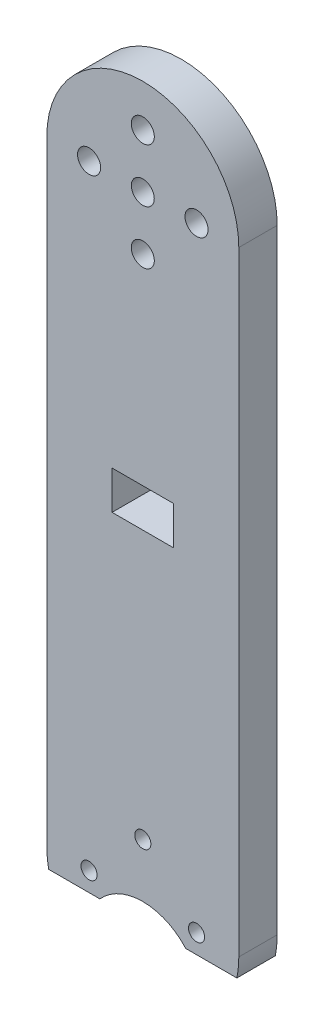
ISO-10303-21;
HEADER;
FILE_DESCRIPTION(('STEP AP214'),'2;1');
FILE_NAME('part.step','',(''),(''),'','','');
FILE_SCHEMA(('AUTOMOTIVE_DESIGN { 1 0 10303 214 1 1 1 1 }'));
ENDSEC;
DATA;
#1=APPLICATION_CONTEXT('core data for automotive mechanical design processes');
#2=APPLICATION_PROTOCOL_DEFINITION('international standard','automotive_design',2000,#1);
#3=PRODUCT_CONTEXT('',#1,'mechanical');
#4=PRODUCT('Part','Part','',(#3));
#5=PRODUCT_RELATED_PRODUCT_CATEGORY('part','',(#4));
#6=PRODUCT_DEFINITION_FORMATION('','',#4);
#7=PRODUCT_DEFINITION_CONTEXT('part definition',#1,'design');
#8=PRODUCT_DEFINITION('design','',#6,#7);
#9=PRODUCT_DEFINITION_SHAPE('','',#8);
#10=(LENGTH_UNIT() NAMED_UNIT(*) SI_UNIT(.MILLI.,.METRE.));
#11=(NAMED_UNIT(*) PLANE_ANGLE_UNIT() SI_UNIT($,.RADIAN.));
#12=(NAMED_UNIT(*) SI_UNIT($,.STERADIAN.) SOLID_ANGLE_UNIT());
#13=UNCERTAINTY_MEASURE_WITH_UNIT(LENGTH_MEASURE(1.E-05),#10,'distance_accuracy_value','');
#14=(GEOMETRIC_REPRESENTATION_CONTEXT(3) GLOBAL_UNCERTAINTY_ASSIGNED_CONTEXT((#13)) GLOBAL_UNIT_ASSIGNED_CONTEXT((#10,
#11,#12)) REPRESENTATION_CONTEXT('',''));
#15=CARTESIAN_POINT('',(0.,0.,0.));
#16=DIRECTION('',(0.,0.,1.));
#17=DIRECTION('',(1.,0.,0.));
#18=AXIS2_PLACEMENT_3D('',#15,#16,#17);
#19=CARTESIAN_POINT('',(0.,0.,5.));
#20=DIRECTION('',(0.,0.,1.));
#21=DIRECTION('',(1.,0.,0.));
#22=AXIS2_PLACEMENT_3D('',#19,#20,#21);
#23=PLANE('',#22);
#24=DIRECTION('',(0.,1.,0.));
#25=VECTOR('',#24,1.);
#26=CARTESIAN_POINT('',(4.00000000000001,-33.1138757892952,5.));
#27=LINE('',#26,#25);
#28=CARTESIAN_POINT('',(4.00000000000001,-38.1138757892952,5.));
#29=VERTEX_POINT('',#28);
#30=CARTESIAN_POINT('',(4.00000000000001,-33.1138757892952,5.));
#31=VERTEX_POINT('',#30);
#32=EDGE_CURVE('E73',#29,#31,#27,.T.);
#33=ORIENTED_EDGE('',*,*,#32,.F.);
#34=DIRECTION('',(1.,0.,0.));
#35=VECTOR('',#34,1.);
#36=CARTESIAN_POINT('',(-3.99999999999999,-38.1138757892952,5.));
#37=LINE('',#36,#35);
#38=CARTESIAN_POINT('',(-3.99999999999999,-38.1138757892952,5.));
#39=VERTEX_POINT('',#38);
#40=EDGE_CURVE('E172',#39,#29,#37,.T.);
#41=ORIENTED_EDGE('',*,*,#40,.F.);
#42=DIRECTION('',(0.,-1.,0.));
#43=VECTOR('',#42,1.);
#44=CARTESIAN_POINT('',(-3.99999999999999,-33.1138757892952,5.));
#45=LINE('',#44,#43);
#46=CARTESIAN_POINT('',(-3.99999999999999,-33.1138757892952,5.));
#47=VERTEX_POINT('',#46);
#48=EDGE_CURVE('E169',#47,#39,#45,.T.);
#49=ORIENTED_EDGE('',*,*,#48,.F.);
#50=DIRECTION('',(-1.,0.,0.));
#51=VECTOR('',#50,1.);
#52=CARTESIAN_POINT('',(-3.99999999999999,-33.1138757892952,5.));
#53=LINE('',#52,#51);
#54=EDGE_CURVE('E166',#31,#47,#53,.T.);
#55=ORIENTED_EDGE('',*,*,#54,.F.);
#56=EDGE_LOOP('',(#33,#41,#49,#55));
#57=FACE_BOUND('',#56,.T.);
#58=CARTESIAN_POINT('',(0.,-73.,5.));
#59=DIRECTION('',(0.,0.,1.));
#60=DIRECTION('',(1.,0.,0.));
#61=AXIS2_PLACEMENT_3D('',#58,#59,#60);
#62=CIRCLE('',#61,1.04999999999999);
#63=CARTESIAN_POINT('',(1.05,-73.,5.));
#64=VERTEX_POINT('',#63);
#65=EDGE_CURVE('E190',#64,#64,#62,.T.);
#66=ORIENTED_EDGE('',*,*,#65,.F.);
#67=EDGE_LOOP('',(#66));
#68=FACE_BOUND('',#67,.T.);
#69=CARTESIAN_POINT('',(6.9938757892945,7.92113862242925E-13,5.));
#70=DIRECTION('',(0.,0.,1.));
#71=DIRECTION('',(1.,0.,0.));
#72=AXIS2_PLACEMENT_3D('',#69,#70,#71);
#73=CIRCLE('',#72,1.50000000000046);
#74=CARTESIAN_POINT('',(8.49387578929496,7.92113862242925E-13,5.));
#75=VERTEX_POINT('',#74);
#76=EDGE_CURVE('E202',#75,#75,#73,.T.);
#77=ORIENTED_EDGE('',*,*,#76,.F.);
#78=EDGE_LOOP('',(#77));
#79=FACE_BOUND('',#78,.T.);
#80=CARTESIAN_POINT('',(0.,0.,5.));
#81=DIRECTION('',(0.,0.,1.));
#82=DIRECTION('',(1.,0.,0.));
#83=AXIS2_PLACEMENT_3D('',#80,#81,#82);
#84=CIRCLE('',#83,1.49387578929371);
#85=CARTESIAN_POINT('',(1.49387578929371,0.,5.));
#86=VERTEX_POINT('',#85);
#87=EDGE_CURVE('E214',#86,#86,#84,.T.);
#88=ORIENTED_EDGE('',*,*,#87,.F.);
#89=EDGE_LOOP('',(#88));
#90=FACE_BOUND('',#89,.T.);
#91=CARTESIAN_POINT('',(0.,6.99387578929371,5.));
#92=DIRECTION('',(0.,0.,1.));
#93=DIRECTION('',(1.,0.,0.));
#94=AXIS2_PLACEMENT_3D('',#91,#92,#93);
#95=CIRCLE('',#94,1.5);
#96=CARTESIAN_POINT('',(1.5,6.99387578929371,5.));
#97=VERTEX_POINT('',#96);
#98=EDGE_CURVE('E226',#97,#97,#95,.T.);
#99=ORIENTED_EDGE('',*,*,#98,.F.);
#100=EDGE_LOOP('',(#99));
#101=FACE_BOUND('',#100,.T.);
#102=CARTESIAN_POINT('',(-6.99387578929291,-7.92970365002825E-13,5.));
#103=DIRECTION('',(0.,0.,1.));
#104=DIRECTION('',(1.,0.,0.));
#105=AXIS2_PLACEMENT_3D('',#102,#103,#104);
#106=CIRCLE('',#105,1.50000000000097);
#107=CARTESIAN_POINT('',(-5.49387578929195,-7.92970365002825E-13,5.));
#108=VERTEX_POINT('',#107);
#109=EDGE_CURVE('E220',#108,#108,#106,.T.);
#110=ORIENTED_EDGE('',*,*,#109,.F.);
#111=EDGE_LOOP('',(#110));
#112=FACE_BOUND('',#111,.T.);
#113=CARTESIAN_POINT('',(1.58594073000565E-12,-6.99387578929371,5.));
#114=DIRECTION('',(0.,0.,1.));
#115=DIRECTION('',(1.,0.,0.));
#116=AXIS2_PLACEMENT_3D('',#113,#114,#115);
#117=CIRCLE('',#116,1.50000000000147);
#118=CARTESIAN_POINT('',(1.50000000000306,-6.99387578929371,5.));
#119=VERTEX_POINT('',#118);
#120=EDGE_CURVE('E208',#119,#119,#117,.T.);
#121=ORIENTED_EDGE('',*,*,#120,.F.);
#122=EDGE_LOOP('',(#121));
#123=FACE_BOUND('',#122,.T.);
#124=CARTESIAN_POINT('',(-6.99999999999998,-80.,5.));
#125=DIRECTION('',(0.,0.,1.));
#126=DIRECTION('',(1.,0.,0.));
#127=AXIS2_PLACEMENT_3D('',#124,#125,#126);
#128=CIRCLE('',#127,1.04999999999999);
#129=CARTESIAN_POINT('',(-5.94999999999998,-80.,5.));
#130=VERTEX_POINT('',#129);
#131=EDGE_CURVE('E196',#130,#130,#128,.T.);
#132=ORIENTED_EDGE('',*,*,#131,.F.);
#133=EDGE_LOOP('',(#132));
#134=FACE_BOUND('',#133,.T.);
#135=CARTESIAN_POINT('',(7.00000000000003,-80.,5.));
#136=DIRECTION('',(0.,0.,1.));
#137=DIRECTION('',(1.,0.,0.));
#138=AXIS2_PLACEMENT_3D('',#135,#136,#137);
#139=CIRCLE('',#138,1.04999999999999);
#140=CARTESIAN_POINT('',(8.05000000000002,-80.,5.));
#141=VERTEX_POINT('',#140);
#142=EDGE_CURVE('E184',#141,#141,#139,.T.);
#143=ORIENTED_EDGE('',*,*,#142,.F.);
#144=EDGE_LOOP('',(#143));
#145=FACE_BOUND('',#144,.T.);
#146=CARTESIAN_POINT('',(0.,-87.5,5.));
#147=DIRECTION('',(0.,0.,1.));
#148=DIRECTION('',(1.,0.,0.));
#149=AXIS2_PLACEMENT_3D('',#146,#147,#148);
#150=CIRCLE('',#149,7.50000000000001);
#151=CARTESIAN_POINT('',(5.59016994374949,-82.5,5.));
#152=VERTEX_POINT('',#151);
#153=CARTESIAN_POINT('',(-5.59016994374949,-82.5,5.));
#154=VERTEX_POINT('',#153);
#155=EDGE_CURVE('E145',#152,#154,#150,.T.);
#156=ORIENTED_EDGE('',*,*,#155,.F.);
#157=DIRECTION('',(1.,0.,0.));
#158=VECTOR('',#157,1.);
#159=CARTESIAN_POINT('',(-12.2474487139159,-82.5,5.));
#160=LINE('',#159,#158);
#161=CARTESIAN_POINT('',(12.2474487139159,-82.5,5.));
#162=VERTEX_POINT('',#161);
#163=EDGE_CURVE('E152',#152,#162,#160,.T.);
#164=ORIENTED_EDGE('',*,*,#163,.T.);
#165=CARTESIAN_POINT('',(0.,-80.,5.));
#166=DIRECTION('',(0.,0.,1.));
#167=DIRECTION('',(1.,0.,0.));
#168=AXIS2_PLACEMENT_3D('',#165,#166,#167);
#169=CIRCLE('',#168,12.5);
#170=CARTESIAN_POINT('',(12.5,-80.,5.));
#171=VERTEX_POINT('',#170);
#172=EDGE_CURVE('E238',#162,#171,#169,.T.);
#173=ORIENTED_EDGE('',*,*,#172,.T.);
#174=DIRECTION('',(0.,1.,0.));
#175=VECTOR('',#174,1.);
#176=CARTESIAN_POINT('',(12.5,0.,5.));
#177=LINE('',#176,#175);
#178=CARTESIAN_POINT('',(12.5,0.,5.));
#179=VERTEX_POINT('',#178);
#180=EDGE_CURVE('E241',#171,#179,#177,.T.);
#181=ORIENTED_EDGE('',*,*,#180,.T.);
#182=CARTESIAN_POINT('',(0.,0.,5.));
#183=DIRECTION('',(0.,0.,1.));
#184=DIRECTION('',(1.,0.,0.));
#185=AXIS2_PLACEMENT_3D('',#182,#183,#184);
#186=CIRCLE('',#185,12.5);
#187=CARTESIAN_POINT('',(-12.5,0.,5.));
#188=VERTEX_POINT('',#187);
#189=EDGE_CURVE('E232',#179,#188,#186,.T.);
#190=ORIENTED_EDGE('',*,*,#189,.T.);
#191=DIRECTION('',(0.,-1.,0.));
#192=VECTOR('',#191,1.);
#193=CARTESIAN_POINT('',(-12.5,0.,5.));
#194=LINE('',#193,#192);
#195=CARTESIAN_POINT('',(-12.5,-80.,5.));
#196=VERTEX_POINT('',#195);
#197=EDGE_CURVE('E235',#188,#196,#194,.T.);
#198=ORIENTED_EDGE('',*,*,#197,.T.);
#199=CARTESIAN_POINT('',(-12.2474487139159,-82.5,5.));
#200=VERTEX_POINT('',#199);
#201=EDGE_CURVE('E239',#196,#200,#169,.T.);
#202=ORIENTED_EDGE('',*,*,#201,.T.);
#203=EDGE_CURVE('E65',#200,#154,#160,.T.);
#204=ORIENTED_EDGE('',*,*,#203,.T.);
#205=EDGE_LOOP('',(#156,#164,#173,#181,#190,#198,#202,#204));
#206=FACE_BOUND('',#205,.T.);
#207=ADVANCED_FACE('F50',(#57,#68,#79,#90,#101,#112,#123,#134,#145,#206),#23,.T.);
#208=CARTESIAN_POINT('',(0.,0.,0.));
#209=DIRECTION('',(0.,0.,1.));
#210=DIRECTION('',(1.,0.,0.));
#211=AXIS2_PLACEMENT_3D('',#208,#209,#210);
#212=PLANE('',#211);
#213=CARTESIAN_POINT('',(7.00000000000003,-80.,0.));
#214=DIRECTION('',(0.,0.,1.));
#215=DIRECTION('',(1.,0.,0.));
#216=AXIS2_PLACEMENT_3D('',#213,#214,#215);
#217=CIRCLE('',#216,1.04999999999999);
#218=CARTESIAN_POINT('',(8.05000000000002,-80.,0.));
#219=VERTEX_POINT('',#218);
#220=EDGE_CURVE('E178',#219,#219,#217,.T.);
#221=ORIENTED_EDGE('',*,*,#220,.T.);
#222=EDGE_LOOP('',(#221));
#223=FACE_BOUND('',#222,.T.);
#224=CARTESIAN_POINT('',(0.,-73.,0.));
#225=DIRECTION('',(0.,0.,1.));
#226=DIRECTION('',(1.,0.,0.));
#227=AXIS2_PLACEMENT_3D('',#224,#225,#226);
#228=CIRCLE('',#227,1.04999999999999);
#229=CARTESIAN_POINT('',(1.05,-73.,0.));
#230=VERTEX_POINT('',#229);
#231=EDGE_CURVE('E187',#230,#230,#228,.T.);
#232=ORIENTED_EDGE('',*,*,#231,.T.);
#233=EDGE_LOOP('',(#232));
#234=FACE_BOUND('',#233,.T.);
#235=CARTESIAN_POINT('',(-6.99999999999998,-80.,0.));
#236=DIRECTION('',(0.,0.,1.));
#237=DIRECTION('',(1.,0.,0.));
#238=AXIS2_PLACEMENT_3D('',#235,#236,#237);
#239=CIRCLE('',#238,1.04999999999999);
#240=CARTESIAN_POINT('',(-5.94999999999998,-80.,0.));
#241=VERTEX_POINT('',#240);
#242=EDGE_CURVE('E193',#241,#241,#239,.T.);
#243=ORIENTED_EDGE('',*,*,#242,.T.);
#244=EDGE_LOOP('',(#243));
#245=FACE_BOUND('',#244,.T.);
#246=CARTESIAN_POINT('',(6.9938757892945,7.92113862242925E-13,0.));
#247=DIRECTION('',(0.,0.,1.));
#248=DIRECTION('',(1.,0.,0.));
#249=AXIS2_PLACEMENT_3D('',#246,#247,#248);
#250=CIRCLE('',#249,1.50000000000046);
#251=CARTESIAN_POINT('',(8.49387578929496,7.92113862242925E-13,0.));
#252=VERTEX_POINT('',#251);
#253=EDGE_CURVE('E199',#252,#252,#250,.T.);
#254=ORIENTED_EDGE('',*,*,#253,.T.);
#255=EDGE_LOOP('',(#254));
#256=FACE_BOUND('',#255,.T.);
#257=CARTESIAN_POINT('',(1.58594073000565E-12,-6.99387578929371,0.));
#258=DIRECTION('',(0.,0.,1.));
#259=DIRECTION('',(1.,0.,0.));
#260=AXIS2_PLACEMENT_3D('',#257,#258,#259);
#261=CIRCLE('',#260,1.50000000000147);
#262=CARTESIAN_POINT('',(1.50000000000306,-6.99387578929371,0.));
#263=VERTEX_POINT('',#262);
#264=EDGE_CURVE('E205',#263,#263,#261,.T.);
#265=ORIENTED_EDGE('',*,*,#264,.T.);
#266=EDGE_LOOP('',(#265));
#267=FACE_BOUND('',#266,.T.);
#268=CARTESIAN_POINT('',(0.,0.,0.));
#269=DIRECTION('',(0.,0.,1.));
#270=DIRECTION('',(1.,0.,0.));
#271=AXIS2_PLACEMENT_3D('',#268,#269,#270);
#272=CIRCLE('',#271,1.49387578929371);
#273=CARTESIAN_POINT('',(1.49387578929371,0.,0.));
#274=VERTEX_POINT('',#273);
#275=EDGE_CURVE('E211',#274,#274,#272,.T.);
#276=ORIENTED_EDGE('',*,*,#275,.T.);
#277=EDGE_LOOP('',(#276));
#278=FACE_BOUND('',#277,.T.);
#279=CARTESIAN_POINT('',(-6.99387578929291,-7.92970365002825E-13,0.));
#280=DIRECTION('',(0.,0.,1.));
#281=DIRECTION('',(1.,0.,0.));
#282=AXIS2_PLACEMENT_3D('',#279,#280,#281);
#283=CIRCLE('',#282,1.50000000000097);
#284=CARTESIAN_POINT('',(-5.49387578929195,-7.92970365002825E-13,0.));
#285=VERTEX_POINT('',#284);
#286=EDGE_CURVE('E217',#285,#285,#283,.T.);
#287=ORIENTED_EDGE('',*,*,#286,.T.);
#288=EDGE_LOOP('',(#287));
#289=FACE_BOUND('',#288,.T.);
#290=CARTESIAN_POINT('',(0.,6.99387578929371,0.));
#291=DIRECTION('',(0.,0.,1.));
#292=DIRECTION('',(1.,0.,0.));
#293=AXIS2_PLACEMENT_3D('',#290,#291,#292);
#294=CIRCLE('',#293,1.5);
#295=CARTESIAN_POINT('',(1.5,6.99387578929371,0.));
#296=VERTEX_POINT('',#295);
#297=EDGE_CURVE('E223',#296,#296,#294,.T.);
#298=ORIENTED_EDGE('',*,*,#297,.T.);
#299=EDGE_LOOP('',(#298));
#300=FACE_BOUND('',#299,.T.);
#301=DIRECTION('',(1.,0.,0.));
#302=VECTOR('',#301,1.);
#303=CARTESIAN_POINT('',(0.,-38.1138757892952,0.));
#304=LINE('',#303,#302);
#305=CARTESIAN_POINT('',(-3.99999999999999,-38.1138757892952,0.));
#306=VERTEX_POINT('',#305);
#307=CARTESIAN_POINT('',(4.00000000000001,-38.1138757892952,0.));
#308=VERTEX_POINT('',#307);
#309=EDGE_CURVE('E270',#306,#308,#304,.T.);
#310=ORIENTED_EDGE('',*,*,#309,.T.);
#311=DIRECTION('',(0.,1.,0.));
#312=VECTOR('',#311,1.);
#313=CARTESIAN_POINT('',(4.00000000000001,0.,0.));
#314=LINE('',#313,#312);
#315=CARTESIAN_POINT('',(4.00000000000001,-33.1138757892952,0.));
#316=VERTEX_POINT('',#315);
#317=EDGE_CURVE('E273',#308,#316,#314,.T.);
#318=ORIENTED_EDGE('',*,*,#317,.T.);
#319=DIRECTION('',(-1.,0.,0.));
#320=VECTOR('',#319,1.);
#321=CARTESIAN_POINT('',(0.,-33.1138757892952,0.));
#322=LINE('',#321,#320);
#323=CARTESIAN_POINT('',(-3.99999999999999,-33.1138757892952,0.));
#324=VERTEX_POINT('',#323);
#325=EDGE_CURVE('E264',#316,#324,#322,.T.);
#326=ORIENTED_EDGE('',*,*,#325,.T.);
#327=DIRECTION('',(0.,-1.,0.));
#328=VECTOR('',#327,1.);
#329=CARTESIAN_POINT('',(-3.99999999999999,0.,0.));
#330=LINE('',#329,#328);
#331=EDGE_CURVE('E267',#324,#306,#330,.T.);
#332=ORIENTED_EDGE('',*,*,#331,.T.);
#333=EDGE_LOOP('',(#310,#318,#326,#332));
#334=FACE_BOUND('',#333,.T.);
#335=DIRECTION('',(1.,0.,0.));
#336=VECTOR('',#335,1.);
#337=CARTESIAN_POINT('',(0.,-82.5,0.));
#338=LINE('',#337,#336);
#339=CARTESIAN_POINT('',(5.59016994374949,-82.5,0.));
#340=VERTEX_POINT('',#339);
#341=CARTESIAN_POINT('',(12.2474487139159,-82.5,0.));
#342=VERTEX_POINT('',#341);
#343=EDGE_CURVE('E163',#340,#342,#338,.T.);
#344=ORIENTED_EDGE('',*,*,#343,.F.);
#345=CARTESIAN_POINT('',(0.,-87.5,0.));
#346=DIRECTION('',(0.,0.,1.));
#347=DIRECTION('',(1.,0.,0.));
#348=AXIS2_PLACEMENT_3D('',#345,#346,#347);
#349=CIRCLE('',#348,7.50000000000001);
#350=CARTESIAN_POINT('',(-5.59016994374949,-82.5,0.));
#351=VERTEX_POINT('',#350);
#352=EDGE_CURVE('E12',#340,#351,#349,.T.);
#353=ORIENTED_EDGE('',*,*,#352,.T.);
#354=DIRECTION('',(1.,0.,0.));
#355=VECTOR('',#354,1.);
#356=CARTESIAN_POINT('',(0.,-82.5,0.));
#357=LINE('',#356,#355);
#358=CARTESIAN_POINT('',(-12.2474487139159,-82.5,0.));
#359=VERTEX_POINT('',#358);
#360=EDGE_CURVE('E148',#359,#351,#357,.T.);
#361=ORIENTED_EDGE('',*,*,#360,.F.);
#362=CARTESIAN_POINT('',(0.,-80.,0.));
#363=DIRECTION('',(0.,0.,1.));
#364=DIRECTION('',(1.,0.,0.));
#365=AXIS2_PLACEMENT_3D('',#362,#363,#364);
#366=CIRCLE('',#365,12.5);
#367=CARTESIAN_POINT('',(-12.5,-80.,0.));
#368=VERTEX_POINT('',#367);
#369=EDGE_CURVE('E249',#368,#359,#366,.T.);
#370=ORIENTED_EDGE('',*,*,#369,.F.);
#371=DIRECTION('',(0.,-1.,0.));
#372=VECTOR('',#371,1.);
#373=CARTESIAN_POINT('',(-12.5,0.,0.));
#374=LINE('',#373,#372);
#375=CARTESIAN_POINT('',(-12.5,0.,0.));
#376=VERTEX_POINT('',#375);
#377=EDGE_CURVE('E246',#376,#368,#374,.T.);
#378=ORIENTED_EDGE('',*,*,#377,.F.);
#379=CARTESIAN_POINT('',(0.,0.,0.));
#380=DIRECTION('',(0.,0.,1.));
#381=DIRECTION('',(1.,0.,0.));
#382=AXIS2_PLACEMENT_3D('',#379,#380,#381);
#383=CIRCLE('',#382,12.5);
#384=CARTESIAN_POINT('',(12.5,0.,0.));
#385=VERTEX_POINT('',#384);
#386=EDGE_CURVE('E229',#385,#376,#383,.T.);
#387=ORIENTED_EDGE('',*,*,#386,.F.);
#388=DIRECTION('',(0.,1.,0.));
#389=VECTOR('',#388,1.);
#390=CARTESIAN_POINT('',(12.5,0.,0.));
#391=LINE('',#390,#389);
#392=CARTESIAN_POINT('',(12.5,-80.,0.));
#393=VERTEX_POINT('',#392);
#394=EDGE_CURVE('E236',#393,#385,#391,.T.);
#395=ORIENTED_EDGE('',*,*,#394,.F.);
#396=EDGE_CURVE('E248',#342,#393,#366,.T.);
#397=ORIENTED_EDGE('',*,*,#396,.F.);
#398=EDGE_LOOP('',(#344,#353,#361,#370,#378,#387,#395,#397));
#399=FACE_BOUND('',#398,.T.);
#400=ADVANCED_FACE('F283',(#223,#234,#245,#256,#267,#278,#289,#300,#334,#399),#212,.F.);
#401=CARTESIAN_POINT('',(0.,-80.,5.));
#402=DIRECTION('',(0.,0.,-1.));
#403=DIRECTION('',(-1.,0.,0.));
#404=AXIS2_PLACEMENT_3D('',#401,#402,#403);
#405=CYLINDRICAL_SURFACE('',#404,12.5);
#406=DIRECTION('',(0.,0.,-1.));
#407=VECTOR('',#406,1.);
#408=CARTESIAN_POINT('',(-12.2474487139159,-82.5,5.));
#409=LINE('',#408,#407);
#410=EDGE_CURVE('E276',#200,#359,#409,.T.);
#411=ORIENTED_EDGE('',*,*,#410,.F.);
#412=ORIENTED_EDGE('',*,*,#201,.F.);
#413=DIRECTION('',(0.,0.,-1.));
#414=VECTOR('',#413,1.);
#415=CARTESIAN_POINT('',(-12.5,-80.,5.));
#416=LINE('',#415,#414);
#417=EDGE_CURVE('E258',#196,#368,#416,.T.);
#418=ORIENTED_EDGE('',*,*,#417,.T.);
#419=ORIENTED_EDGE('',*,*,#369,.T.);
#420=EDGE_LOOP('',(#411,#412,#418,#419));
#421=FACE_BOUND('',#420,.T.);
#422=ADVANCED_FACE('F298',(#421),#405,.T.);
#423=CARTESIAN_POINT('',(0.,0.,5.));
#424=DIRECTION('',(0.,0.,-1.));
#425=DIRECTION('',(-1.,0.,0.));
#426=AXIS2_PLACEMENT_3D('',#423,#424,#425);
#427=CYLINDRICAL_SURFACE('',#426,12.5);
#428=ORIENTED_EDGE('',*,*,#386,.T.);
#429=DIRECTION('',(0.,0.,-1.));
#430=VECTOR('',#429,1.);
#431=CARTESIAN_POINT('',(-12.5,0.,5.));
#432=LINE('',#431,#430);
#433=EDGE_CURVE('E261',#188,#376,#432,.T.);
#434=ORIENTED_EDGE('',*,*,#433,.F.);
#435=ORIENTED_EDGE('',*,*,#189,.F.);
#436=DIRECTION('',(0.,0.,-1.));
#437=VECTOR('',#436,1.);
#438=CARTESIAN_POINT('',(12.5,0.,5.));
#439=LINE('',#438,#437);
#440=EDGE_CURVE('E243',#179,#385,#439,.T.);
#441=ORIENTED_EDGE('',*,*,#440,.T.);
#442=EDGE_LOOP('',(#428,#434,#435,#441));
#443=FACE_BOUND('',#442,.T.);
#444=ADVANCED_FACE('F52',(#443),#427,.T.);
#445=CARTESIAN_POINT('',(-12.5,0.,5.));
#446=DIRECTION('',(1.,0.,0.));
#447=DIRECTION('',(0.,1.,0.));
#448=AXIS2_PLACEMENT_3D('',#445,#446,#447);
#449=PLANE('',#448);
#450=ORIENTED_EDGE('',*,*,#377,.T.);
#451=ORIENTED_EDGE('',*,*,#417,.F.);
#452=ORIENTED_EDGE('',*,*,#197,.F.);
#453=ORIENTED_EDGE('',*,*,#433,.T.);
#454=EDGE_LOOP('',(#450,#451,#452,#453));
#455=FACE_BOUND('',#454,.T.);
#456=ADVANCED_FACE('F295',(#455),#449,.F.);
#457=ORIENTED_EDGE('',*,*,#172,.F.);
#458=DIRECTION('',(0.,0.,-1.));
#459=VECTOR('',#458,1.);
#460=CARTESIAN_POINT('',(12.2474487139159,-82.5,5.));
#461=LINE('',#460,#459);
#462=EDGE_CURVE('E58',#162,#342,#461,.T.);
#463=ORIENTED_EDGE('',*,*,#462,.T.);
#464=ORIENTED_EDGE('',*,*,#396,.T.);
#465=DIRECTION('',(0.,0.,-1.));
#466=VECTOR('',#465,1.);
#467=CARTESIAN_POINT('',(12.5,-80.,5.));
#468=LINE('',#467,#466);
#469=EDGE_CURVE('E255',#171,#393,#468,.T.);
#470=ORIENTED_EDGE('',*,*,#469,.F.);
#471=EDGE_LOOP('',(#457,#463,#464,#470));
#472=FACE_BOUND('',#471,.T.);
#473=ADVANCED_FACE('F279',(#472),#405,.T.);
#474=CARTESIAN_POINT('',(12.5,0.,5.));
#475=DIRECTION('',(-1.,0.,0.));
#476=DIRECTION('',(0.,-1.,0.));
#477=AXIS2_PLACEMENT_3D('',#474,#475,#476);
#478=PLANE('',#477);
#479=ORIENTED_EDGE('',*,*,#394,.T.);
#480=ORIENTED_EDGE('',*,*,#440,.F.);
#481=ORIENTED_EDGE('',*,*,#180,.F.);
#482=ORIENTED_EDGE('',*,*,#469,.T.);
#483=EDGE_LOOP('',(#479,#480,#481,#482));
#484=FACE_BOUND('',#483,.T.);
#485=ADVANCED_FACE('F287',(#484),#478,.F.);
#486=CARTESIAN_POINT('',(0.,6.99387578929371,5.));
#487=DIRECTION('',(0.,0.,-1.));
#488=DIRECTION('',(-1.,0.,0.));
#489=AXIS2_PLACEMENT_3D('',#486,#487,#488);
#490=CYLINDRICAL_SURFACE('',#489,1.5);
#491=ORIENTED_EDGE('',*,*,#98,.T.);
#492=EDGE_LOOP('',(#491));
#493=FACE_BOUND('',#492,.T.);
#494=ORIENTED_EDGE('',*,*,#297,.F.);
#495=EDGE_LOOP('',(#494));
#496=FACE_BOUND('',#495,.T.);
#497=ADVANCED_FACE('F318',(#493,#496),#490,.F.);
#498=CARTESIAN_POINT('',(-6.99387578929291,-7.92970365002825E-13,5.));
#499=DIRECTION('',(0.,0.,-1.));
#500=DIRECTION('',(-1.,0.,0.));
#501=AXIS2_PLACEMENT_3D('',#498,#499,#500);
#502=CYLINDRICAL_SURFACE('',#501,1.50000000000097);
#503=ORIENTED_EDGE('',*,*,#109,.T.);
#504=EDGE_LOOP('',(#503));
#505=FACE_BOUND('',#504,.T.);
#506=ORIENTED_EDGE('',*,*,#286,.F.);
#507=EDGE_LOOP('',(#506));
#508=FACE_BOUND('',#507,.T.);
#509=ADVANCED_FACE('F442',(#505,#508),#502,.F.);
#510=CARTESIAN_POINT('',(0.,0.,5.));
#511=DIRECTION('',(0.,0.,-1.));
#512=DIRECTION('',(-1.,0.,0.));
#513=AXIS2_PLACEMENT_3D('',#510,#511,#512);
#514=CYLINDRICAL_SURFACE('',#513,1.49387578929371);
#515=ORIENTED_EDGE('',*,*,#87,.T.);
#516=EDGE_LOOP('',(#515));
#517=FACE_BOUND('',#516,.T.);
#518=ORIENTED_EDGE('',*,*,#275,.F.);
#519=EDGE_LOOP('',(#518));
#520=FACE_BOUND('',#519,.T.);
#521=ADVANCED_FACE('F432',(#517,#520),#514,.F.);
#522=CARTESIAN_POINT('',(1.58594073000565E-12,-6.99387578929371,5.));
#523=DIRECTION('',(0.,0.,-1.));
#524=DIRECTION('',(-1.,0.,0.));
#525=AXIS2_PLACEMENT_3D('',#522,#523,#524);
#526=CYLINDRICAL_SURFACE('',#525,1.50000000000147);
#527=ORIENTED_EDGE('',*,*,#120,.T.);
#528=EDGE_LOOP('',(#527));
#529=FACE_BOUND('',#528,.T.);
#530=ORIENTED_EDGE('',*,*,#264,.F.);
#531=EDGE_LOOP('',(#530));
#532=FACE_BOUND('',#531,.T.);
#533=ADVANCED_FACE('F422',(#529,#532),#526,.F.);
#534=CARTESIAN_POINT('',(6.9938757892945,7.92113862242925E-13,5.));
#535=DIRECTION('',(0.,0.,-1.));
#536=DIRECTION('',(-1.,0.,0.));
#537=AXIS2_PLACEMENT_3D('',#534,#535,#536);
#538=CYLINDRICAL_SURFACE('',#537,1.50000000000046);
#539=ORIENTED_EDGE('',*,*,#76,.T.);
#540=EDGE_LOOP('',(#539));
#541=FACE_BOUND('',#540,.T.);
#542=ORIENTED_EDGE('',*,*,#253,.F.);
#543=EDGE_LOOP('',(#542));
#544=FACE_BOUND('',#543,.T.);
#545=ADVANCED_FACE('F412',(#541,#544),#538,.F.);
#546=CARTESIAN_POINT('',(-6.99999999999998,-80.,5.));
#547=DIRECTION('',(0.,0.,-1.));
#548=DIRECTION('',(-1.,0.,0.));
#549=AXIS2_PLACEMENT_3D('',#546,#547,#548);
#550=CYLINDRICAL_SURFACE('',#549,1.04999999999999);
#551=ORIENTED_EDGE('',*,*,#131,.T.);
#552=EDGE_LOOP('',(#551));
#553=FACE_BOUND('',#552,.T.);
#554=ORIENTED_EDGE('',*,*,#242,.F.);
#555=EDGE_LOOP('',(#554));
#556=FACE_BOUND('',#555,.T.);
#557=ADVANCED_FACE('F402',(#553,#556),#550,.F.);
#558=CARTESIAN_POINT('',(0.,-73.,5.));
#559=DIRECTION('',(0.,0.,-1.));
#560=DIRECTION('',(-1.,0.,0.));
#561=AXIS2_PLACEMENT_3D('',#558,#559,#560);
#562=CYLINDRICAL_SURFACE('',#561,1.04999999999999);
#563=ORIENTED_EDGE('',*,*,#65,.T.);
#564=EDGE_LOOP('',(#563));
#565=FACE_BOUND('',#564,.T.);
#566=ORIENTED_EDGE('',*,*,#231,.F.);
#567=EDGE_LOOP('',(#566));
#568=FACE_BOUND('',#567,.T.);
#569=ADVANCED_FACE('F392',(#565,#568),#562,.F.);
#570=CARTESIAN_POINT('',(7.00000000000003,-80.,5.));
#571=DIRECTION('',(0.,0.,-1.));
#572=DIRECTION('',(-1.,0.,0.));
#573=AXIS2_PLACEMENT_3D('',#570,#571,#572);
#574=CYLINDRICAL_SURFACE('',#573,1.04999999999999);
#575=ORIENTED_EDGE('',*,*,#142,.T.);
#576=EDGE_LOOP('',(#575));
#577=FACE_BOUND('',#576,.T.);
#578=ORIENTED_EDGE('',*,*,#220,.F.);
#579=EDGE_LOOP('',(#578));
#580=FACE_BOUND('',#579,.T.);
#581=ADVANCED_FACE('F383',(#577,#580),#574,.F.);
#582=CARTESIAN_POINT('',(4.00000000000001,-33.1138757892952,-5.));
#583=DIRECTION('',(1.,0.,0.));
#584=DIRECTION('',(0.,0.,-1.));
#585=AXIS2_PLACEMENT_3D('',#582,#583,#584);
#586=PLANE('',#585);
#587=DIRECTION('',(0.,0.,1.));
#588=VECTOR('',#587,1.);
#589=CARTESIAN_POINT('',(4.00000000000001,-38.1138757892952,-5.));
#590=LINE('',#589,#588);
#591=EDGE_CURVE('E176',#308,#29,#590,.T.);
#592=ORIENTED_EDGE('',*,*,#591,.T.);
#593=ORIENTED_EDGE('',*,*,#32,.T.);
#594=DIRECTION('',(0.,0.,1.));
#595=VECTOR('',#594,1.);
#596=CARTESIAN_POINT('',(4.00000000000001,-33.1138757892952,-5.));
#597=LINE('',#596,#595);
#598=EDGE_CURVE('E175',#316,#31,#597,.T.);
#599=ORIENTED_EDGE('',*,*,#598,.F.);
#600=ORIENTED_EDGE('',*,*,#317,.F.);
#601=EDGE_LOOP('',(#592,#593,#599,#600));
#602=FACE_BOUND('',#601,.T.);
#603=ADVANCED_FACE('F374',(#602),#586,.F.);
#604=CARTESIAN_POINT('',(-3.99999999999999,-38.1138757892952,-5.));
#605=DIRECTION('',(0.,-1.,0.));
#606=DIRECTION('',(0.,0.,-1.));
#607=AXIS2_PLACEMENT_3D('',#604,#605,#606);
#608=PLANE('',#607);
#609=DIRECTION('',(0.,0.,1.));
#610=VECTOR('',#609,1.);
#611=CARTESIAN_POINT('',(-3.99999999999999,-38.1138757892952,-5.));
#612=LINE('',#611,#610);
#613=EDGE_CURVE('E179',#306,#39,#612,.T.);
#614=ORIENTED_EDGE('',*,*,#613,.T.);
#615=ORIENTED_EDGE('',*,*,#40,.T.);
#616=ORIENTED_EDGE('',*,*,#591,.F.);
#617=ORIENTED_EDGE('',*,*,#309,.F.);
#618=EDGE_LOOP('',(#614,#615,#616,#617));
#619=FACE_BOUND('',#618,.T.);
#620=ADVANCED_FACE('F364',(#619),#608,.F.);
#621=CARTESIAN_POINT('',(-3.99999999999999,-33.1138757892952,-5.));
#622=DIRECTION('',(-1.,0.,0.));
#623=DIRECTION('',(0.,0.,1.));
#624=AXIS2_PLACEMENT_3D('',#621,#622,#623);
#625=PLANE('',#624);
#626=DIRECTION('',(0.,0.,1.));
#627=VECTOR('',#626,1.);
#628=CARTESIAN_POINT('',(-3.99999999999999,-33.1138757892952,-5.));
#629=LINE('',#628,#627);
#630=EDGE_CURVE('E181',#324,#47,#629,.T.);
#631=ORIENTED_EDGE('',*,*,#630,.T.);
#632=ORIENTED_EDGE('',*,*,#48,.T.);
#633=ORIENTED_EDGE('',*,*,#613,.F.);
#634=ORIENTED_EDGE('',*,*,#331,.F.);
#635=EDGE_LOOP('',(#631,#632,#633,#634));
#636=FACE_BOUND('',#635,.T.);
#637=ADVANCED_FACE('F353',(#636),#625,.F.);
#638=CARTESIAN_POINT('',(-3.99999999999999,-33.1138757892952,-5.));
#639=DIRECTION('',(0.,1.,0.));
#640=DIRECTION('',(0.,0.,1.));
#641=AXIS2_PLACEMENT_3D('',#638,#639,#640);
#642=PLANE('',#641);
#643=ORIENTED_EDGE('',*,*,#598,.T.);
#644=ORIENTED_EDGE('',*,*,#54,.T.);
#645=ORIENTED_EDGE('',*,*,#630,.F.);
#646=ORIENTED_EDGE('',*,*,#325,.F.);
#647=EDGE_LOOP('',(#643,#644,#645,#646));
#648=FACE_BOUND('',#647,.T.);
#649=ADVANCED_FACE('F348',(#648),#642,.F.);
#650=CARTESIAN_POINT('',(0.,-87.5,-5.));
#651=DIRECTION('',(0.,0.,1.));
#652=DIRECTION('',(1.,0.,0.));
#653=AXIS2_PLACEMENT_3D('',#650,#651,#652);
#654=CYLINDRICAL_SURFACE('',#653,7.50000000000001);
#655=DIRECTION('',(0.,0.,1.));
#656=VECTOR('',#655,1.);
#657=CARTESIAN_POINT('',(5.59016994374949,-82.5,-5.));
#658=LINE('',#657,#656);
#659=EDGE_CURVE('E140',#152,#340,#658,.F.);
#660=ORIENTED_EDGE('',*,*,#659,.F.);
#661=ORIENTED_EDGE('',*,*,#155,.T.);
#662=DIRECTION('',(0.,0.,1.));
#663=VECTOR('',#662,1.);
#664=CARTESIAN_POINT('',(-5.59016994374949,-82.5,-5.));
#665=LINE('',#664,#663);
#666=EDGE_CURVE('E149',#351,#154,#665,.T.);
#667=ORIENTED_EDGE('',*,*,#666,.F.);
#668=ORIENTED_EDGE('',*,*,#352,.F.);
#669=EDGE_LOOP('',(#660,#661,#667,#668));
#670=FACE_BOUND('',#669,.T.);
#671=ADVANCED_FACE('F142',(#670),#654,.F.);
#672=CARTESIAN_POINT('',(-12.2474487139159,-82.5,-5.));
#673=DIRECTION('',(0.,-1.,0.));
#674=DIRECTION('',(0.,0.,-1.));
#675=AXIS2_PLACEMENT_3D('',#672,#673,#674);
#676=PLANE('',#675);
#677=ORIENTED_EDGE('',*,*,#343,.T.);
#678=ORIENTED_EDGE('',*,*,#462,.F.);
#679=ORIENTED_EDGE('',*,*,#163,.F.);
#680=ORIENTED_EDGE('',*,*,#659,.T.);
#681=EDGE_LOOP('',(#677,#678,#679,#680));
#682=FACE_BOUND('',#681,.T.);
#683=ADVANCED_FACE('F153',(#682),#676,.T.);
#684=ORIENTED_EDGE('',*,*,#360,.T.);
#685=ORIENTED_EDGE('',*,*,#666,.T.);
#686=ORIENTED_EDGE('',*,*,#203,.F.);
#687=ORIENTED_EDGE('',*,*,#410,.T.);
#688=EDGE_LOOP('',(#684,#685,#686,#687));
#689=FACE_BOUND('',#688,.T.);
#690=ADVANCED_FACE('F300',(#689),#676,.T.);
#691=CLOSED_SHELL('',(#207,#400,#422,#444,#456,#473,#485,#497,#509,#521,#533,#545,#557,#569,
#581,#603,#620,#637,#649,#671,#683,#690));
#692=MANIFOLD_SOLID_BREP('B2',#691);
#693=ADVANCED_BREP_SHAPE_REPRESENTATION('',(#18,#692),#14);
#694=SHAPE_DEFINITION_REPRESENTATION(#9,#693);
ENDSEC;
END-ISO-10303-21;
